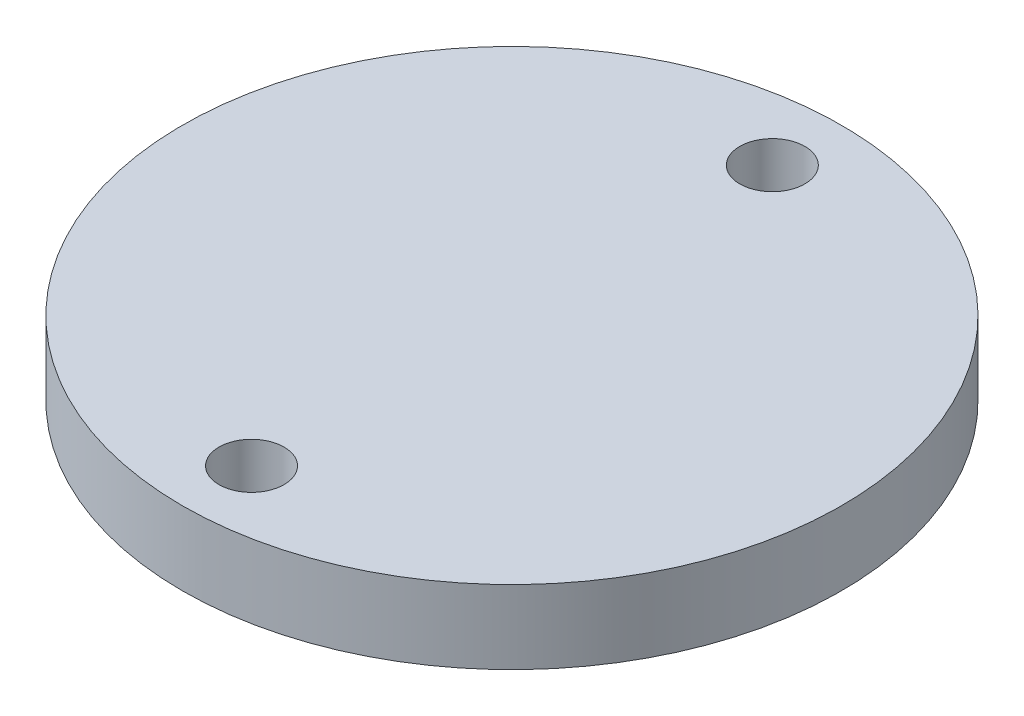
ISO-10303-21;
HEADER;
FILE_DESCRIPTION(('STEP AP214'),'2;1');
FILE_NAME('part.step','',(''),(''),'','','');
FILE_SCHEMA(('AUTOMOTIVE_DESIGN { 1 0 10303 214 1 1 1 1 }'));
ENDSEC;
DATA;
#1=APPLICATION_CONTEXT('core data for automotive mechanical design processes');
#2=APPLICATION_PROTOCOL_DEFINITION('international standard','automotive_design',2000,#1);
#3=PRODUCT_CONTEXT('',#1,'mechanical');
#4=PRODUCT('Part','Part','',(#3));
#5=PRODUCT_RELATED_PRODUCT_CATEGORY('part','',(#4));
#6=PRODUCT_DEFINITION_FORMATION('','',#4);
#7=PRODUCT_DEFINITION_CONTEXT('part definition',#1,'design');
#8=PRODUCT_DEFINITION('design','',#6,#7);
#9=PRODUCT_DEFINITION_SHAPE('','',#8);
#10=(LENGTH_UNIT() NAMED_UNIT(*) SI_UNIT(.MILLI.,.METRE.));
#11=(NAMED_UNIT(*) PLANE_ANGLE_UNIT() SI_UNIT($,.RADIAN.));
#12=(NAMED_UNIT(*) SI_UNIT($,.STERADIAN.) SOLID_ANGLE_UNIT());
#13=UNCERTAINTY_MEASURE_WITH_UNIT(LENGTH_MEASURE(1.E-05),#10,'distance_accuracy_value','');
#14=(GEOMETRIC_REPRESENTATION_CONTEXT(3) GLOBAL_UNCERTAINTY_ASSIGNED_CONTEXT((#13)) GLOBAL_UNIT_ASSIGNED_CONTEXT((#10,
#11,#12)) REPRESENTATION_CONTEXT('',''));
#15=CARTESIAN_POINT('',(0.,0.,0.));
#16=DIRECTION('',(0.,0.,1.));
#17=DIRECTION('',(1.,0.,0.));
#18=AXIS2_PLACEMENT_3D('',#15,#16,#17);
#19=CARTESIAN_POINT('',(0.,2.3,0.));
#20=DIRECTION('',(0.,-1.,0.));
#21=DIRECTION('',(0.,0.,-1.));
#22=AXIS2_PLACEMENT_3D('',#19,#20,#21);
#23=CYLINDRICAL_SURFACE('',#22,10.287);
#24=CARTESIAN_POINT('',(0.,2.3,0.));
#25=DIRECTION('',(0.,1.,0.));
#26=DIRECTION('',(0.,0.,1.));
#27=AXIS2_PLACEMENT_3D('',#24,#25,#26);
#28=CIRCLE('',#27,10.287);
#29=CARTESIAN_POINT('',(0.,2.3,10.287));
#30=VERTEX_POINT('',#29);
#31=EDGE_CURVE('E45',#30,#30,#28,.T.);
#32=ORIENTED_EDGE('',*,*,#31,.F.);
#33=EDGE_LOOP('',(#32));
#34=FACE_BOUND('',#33,.T.);
#35=CARTESIAN_POINT('',(0.,0.,0.));
#36=DIRECTION('',(0.,1.,0.));
#37=DIRECTION('',(0.,0.,1.));
#38=AXIS2_PLACEMENT_3D('',#35,#36,#37);
#39=CIRCLE('',#38,10.287);
#40=CARTESIAN_POINT('',(0.,0.,10.287));
#41=VERTEX_POINT('',#40);
#42=EDGE_CURVE('E41',#41,#41,#39,.T.);
#43=ORIENTED_EDGE('',*,*,#42,.T.);
#44=EDGE_LOOP('',(#43));
#45=FACE_BOUND('',#44,.T.);
#46=ADVANCED_FACE('F38',(#34,#45),#23,.T.);
#47=CARTESIAN_POINT('',(0.,2.3,0.));
#48=DIRECTION('',(0.,1.,0.));
#49=DIRECTION('',(0.,0.,1.));
#50=AXIS2_PLACEMENT_3D('',#47,#48,#49);
#51=PLANE('',#50);
#52=CARTESIAN_POINT('',(0.,2.3,-8.128));
#53=DIRECTION('',(0.,1.,0.));
#54=DIRECTION('',(0.,0.,1.));
#55=AXIS2_PLACEMENT_3D('',#52,#53,#54);
#56=CIRCLE('',#55,1.016);
#57=CARTESIAN_POINT('',(0.,2.3,-7.112));
#58=VERTEX_POINT('',#57);
#59=EDGE_CURVE('E54',#58,#58,#56,.T.);
#60=ORIENTED_EDGE('',*,*,#59,.F.);
#61=EDGE_LOOP('',(#60));
#62=FACE_BOUND('',#61,.T.);
#63=CARTESIAN_POINT('',(0.,2.3,8.128));
#64=DIRECTION('',(0.,1.,0.));
#65=DIRECTION('',(0.,0.,1.));
#66=AXIS2_PLACEMENT_3D('',#63,#64,#65);
#67=CIRCLE('',#66,1.016);
#68=CARTESIAN_POINT('',(0.,2.3,9.144));
#69=VERTEX_POINT('',#68);
#70=EDGE_CURVE('E55',#69,#69,#67,.T.);
#71=ORIENTED_EDGE('',*,*,#70,.F.);
#72=EDGE_LOOP('',(#71));
#73=FACE_BOUND('',#72,.T.);
#74=ORIENTED_EDGE('',*,*,#31,.T.);
#75=EDGE_LOOP('',(#74));
#76=FACE_BOUND('',#75,.T.);
#77=ADVANCED_FACE('F77',(#62,#73,#76),#51,.T.);
#78=CARTESIAN_POINT('',(0.,0.,0.));
#79=DIRECTION('',(0.,1.,0.));
#80=DIRECTION('',(0.,0.,1.));
#81=AXIS2_PLACEMENT_3D('',#78,#79,#80);
#82=PLANE('',#81);
#83=CARTESIAN_POINT('',(0.,0.,-8.128));
#84=DIRECTION('',(0.,1.,0.));
#85=DIRECTION('',(0.,0.,1.));
#86=AXIS2_PLACEMENT_3D('',#83,#84,#85);
#87=CIRCLE('',#86,1.016);
#88=CARTESIAN_POINT('',(0.,0.,-7.112));
#89=VERTEX_POINT('',#88);
#90=EDGE_CURVE('E58',#89,#89,#87,.T.);
#91=ORIENTED_EDGE('',*,*,#90,.T.);
#92=EDGE_LOOP('',(#91));
#93=FACE_BOUND('',#92,.T.);
#94=CARTESIAN_POINT('',(0.,0.,8.128));
#95=DIRECTION('',(0.,1.,0.));
#96=DIRECTION('',(0.,0.,1.));
#97=AXIS2_PLACEMENT_3D('',#94,#95,#96);
#98=CIRCLE('',#97,1.016);
#99=CARTESIAN_POINT('',(0.,0.,9.144));
#100=VERTEX_POINT('',#99);
#101=EDGE_CURVE('E59',#100,#100,#98,.T.);
#102=ORIENTED_EDGE('',*,*,#101,.T.);
#103=EDGE_LOOP('',(#102));
#104=FACE_BOUND('',#103,.T.);
#105=CARTESIAN_POINT('',(0.,0.,0.));
#106=DIRECTION('',(0.,-1.,0.));
#107=DIRECTION('',(0.,0.,-1.));
#108=AXIS2_PLACEMENT_3D('',#105,#106,#107);
#109=CIRCLE('',#108,4.4);
#110=CARTESIAN_POINT('',(0.,0.,-4.4));
#111=VERTEX_POINT('',#110);
#112=EDGE_CURVE('E10',#111,#111,#109,.T.);
#113=ORIENTED_EDGE('',*,*,#112,.F.);
#114=EDGE_LOOP('',(#113));
#115=FACE_BOUND('',#114,.T.);
#116=ORIENTED_EDGE('',*,*,#42,.F.);
#117=EDGE_LOOP('',(#116));
#118=FACE_BOUND('',#117,.T.);
#119=ADVANCED_FACE('F67',(#93,#104,#115,#118),#82,.F.);
#120=CARTESIAN_POINT('',(0.,-3.3,0.));
#121=DIRECTION('',(0.,1.,0.));
#122=DIRECTION('',(0.,0.,1.));
#123=AXIS2_PLACEMENT_3D('',#120,#121,#122);
#124=CYLINDRICAL_SURFACE('',#123,4.4);
#125=CARTESIAN_POINT('',(0.,-3.3,0.));
#126=DIRECTION('',(0.,-1.,0.));
#127=DIRECTION('',(0.,0.,-1.));
#128=AXIS2_PLACEMENT_3D('',#125,#126,#127);
#129=CIRCLE('',#128,4.4);
#130=CARTESIAN_POINT('',(0.,-3.3,-4.4));
#131=VERTEX_POINT('',#130);
#132=EDGE_CURVE('E51',#131,#131,#129,.T.);
#133=ORIENTED_EDGE('',*,*,#132,.F.);
#134=EDGE_LOOP('',(#133));
#135=FACE_BOUND('',#134,.T.);
#136=ORIENTED_EDGE('',*,*,#112,.T.);
#137=EDGE_LOOP('',(#136));
#138=FACE_BOUND('',#137,.T.);
#139=ADVANCED_FACE('F91',(#135,#138),#124,.T.);
#140=CARTESIAN_POINT('',(0.,-3.3,0.));
#141=DIRECTION('',(0.,-1.,0.));
#142=DIRECTION('',(0.,0.,-1.));
#143=AXIS2_PLACEMENT_3D('',#140,#141,#142);
#144=PLANE('',#143);
#145=ORIENTED_EDGE('',*,*,#132,.T.);
#146=EDGE_LOOP('',(#145));
#147=FACE_BOUND('',#146,.T.);
#148=ADVANCED_FACE('F95',(#147),#144,.T.);
#149=CARTESIAN_POINT('',(0.,5.17368195874213,8.128));
#150=DIRECTION('',(0.,-1.,0.));
#151=DIRECTION('',(0.,0.,-1.));
#152=AXIS2_PLACEMENT_3D('',#149,#150,#151);
#153=CYLINDRICAL_SURFACE('',#152,1.016);
#154=ORIENTED_EDGE('',*,*,#101,.F.);
#155=EDGE_LOOP('',(#154));
#156=FACE_BOUND('',#155,.T.);
#157=ORIENTED_EDGE('',*,*,#70,.T.);
#158=EDGE_LOOP('',(#157));
#159=FACE_BOUND('',#158,.T.);
#160=ADVANCED_FACE('F73',(#156,#159),#153,.F.);
#161=CARTESIAN_POINT('',(0.,5.17368195874213,-8.128));
#162=DIRECTION('',(0.,-1.,0.));
#163=DIRECTION('',(0.,0.,-1.));
#164=AXIS2_PLACEMENT_3D('',#161,#162,#163);
#165=CYLINDRICAL_SURFACE('',#164,1.016);
#166=ORIENTED_EDGE('',*,*,#90,.F.);
#167=EDGE_LOOP('',(#166));
#168=FACE_BOUND('',#167,.T.);
#169=ORIENTED_EDGE('',*,*,#59,.T.);
#170=EDGE_LOOP('',(#169));
#171=FACE_BOUND('',#170,.T.);
#172=ADVANCED_FACE('F70',(#168,#171),#165,.F.);
#173=CLOSED_SHELL('',(#46,#77,#119,#139,#148,#160,#172));
#174=MANIFOLD_SOLID_BREP('B2',#173);
#175=ADVANCED_BREP_SHAPE_REPRESENTATION('',(#18,#174),#14);
#176=SHAPE_DEFINITION_REPRESENTATION(#9,#175);
ENDSEC;
END-ISO-10303-21;
